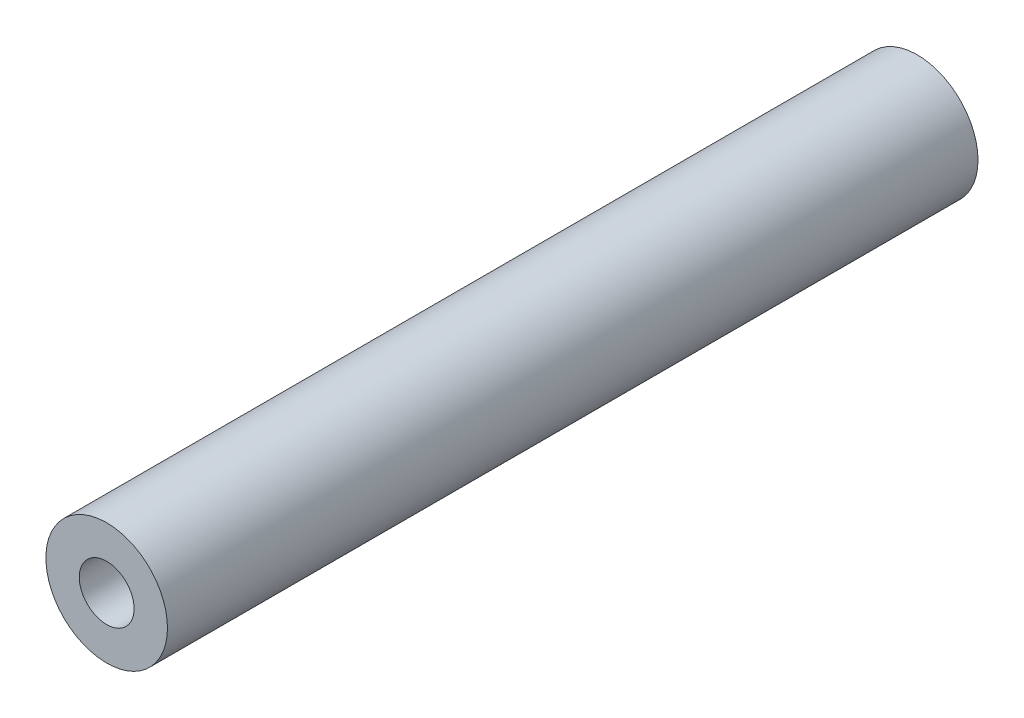
ISO-10303-21;
HEADER;
FILE_DESCRIPTION(('STEP AP214'),'2;1');
FILE_NAME('part.step','',(''),(''),'','','');
FILE_SCHEMA(('AUTOMOTIVE_DESIGN { 1 0 10303 214 1 1 1 1 }'));
ENDSEC;
DATA;
#1=APPLICATION_CONTEXT('core data for automotive mechanical design processes');
#2=APPLICATION_PROTOCOL_DEFINITION('international standard','automotive_design',2000,#1);
#3=PRODUCT_CONTEXT('',#1,'mechanical');
#4=PRODUCT('Part','Part','',(#3));
#5=PRODUCT_RELATED_PRODUCT_CATEGORY('part','',(#4));
#6=PRODUCT_DEFINITION_FORMATION('','',#4);
#7=PRODUCT_DEFINITION_CONTEXT('part definition',#1,'design');
#8=PRODUCT_DEFINITION('design','',#6,#7);
#9=PRODUCT_DEFINITION_SHAPE('','',#8);
#10=(LENGTH_UNIT() NAMED_UNIT(*) SI_UNIT(.MILLI.,.METRE.));
#11=(NAMED_UNIT(*) PLANE_ANGLE_UNIT() SI_UNIT($,.RADIAN.));
#12=(NAMED_UNIT(*) SI_UNIT($,.STERADIAN.) SOLID_ANGLE_UNIT());
#13=UNCERTAINTY_MEASURE_WITH_UNIT(LENGTH_MEASURE(1.E-05),#10,'distance_accuracy_value','');
#14=(GEOMETRIC_REPRESENTATION_CONTEXT(3) GLOBAL_UNCERTAINTY_ASSIGNED_CONTEXT((#13)) GLOBAL_UNIT_ASSIGNED_CONTEXT((#10,
#11,#12)) REPRESENTATION_CONTEXT('',''));
#15=CARTESIAN_POINT('',(0.,0.,0.));
#16=DIRECTION('',(0.,0.,1.));
#17=DIRECTION('',(1.,0.,0.));
#18=AXIS2_PLACEMENT_3D('',#15,#16,#17);
#19=CARTESIAN_POINT('',(0.,0.,40.));
#20=DIRECTION('',(0.,0.,-1.));
#21=DIRECTION('',(-1.,0.,0.));
#22=AXIS2_PLACEMENT_3D('',#19,#20,#21);
#23=CYLINDRICAL_SURFACE('',#22,3.);
#24=CARTESIAN_POINT('',(0.,0.,40.));
#25=DIRECTION('',(0.,0.,1.));
#26=DIRECTION('',(1.,0.,0.));
#27=AXIS2_PLACEMENT_3D('',#24,#25,#26);
#28=CIRCLE('',#27,3.);
#29=CARTESIAN_POINT('',(3.,0.,40.));
#30=VERTEX_POINT('',#29);
#31=EDGE_CURVE('E11',#30,#30,#28,.T.);
#32=ORIENTED_EDGE('',*,*,#31,.F.);
#33=EDGE_LOOP('',(#32));
#34=FACE_BOUND('',#33,.T.);
#35=CARTESIAN_POINT('',(0.,0.,0.));
#36=DIRECTION('',(0.,0.,1.));
#37=DIRECTION('',(1.,0.,0.));
#38=AXIS2_PLACEMENT_3D('',#35,#36,#37);
#39=CIRCLE('',#38,3.);
#40=CARTESIAN_POINT('',(3.,0.,0.));
#41=VERTEX_POINT('',#40);
#42=EDGE_CURVE('E38',#41,#41,#39,.T.);
#43=ORIENTED_EDGE('',*,*,#42,.T.);
#44=EDGE_LOOP('',(#43));
#45=FACE_BOUND('',#44,.T.);
#46=ADVANCED_FACE('F35',(#34,#45),#23,.T.);
#47=CARTESIAN_POINT('',(0.,0.,40.));
#48=DIRECTION('',(0.,0.,1.));
#49=DIRECTION('',(1.,0.,0.));
#50=AXIS2_PLACEMENT_3D('',#47,#48,#49);
#51=PLANE('',#50);
#52=CARTESIAN_POINT('',(0.,0.,40.));
#53=DIRECTION('',(0.,0.,1.));
#54=DIRECTION('',(1.,0.,0.));
#55=AXIS2_PLACEMENT_3D('',#52,#53,#54);
#56=CIRCLE('',#55,1.35254999999999);
#57=CARTESIAN_POINT('',(1.35254999999999,0.,40.));
#58=VERTEX_POINT('',#57);
#59=EDGE_CURVE('E59',#58,#58,#56,.T.);
#60=ORIENTED_EDGE('',*,*,#59,.F.);
#61=EDGE_LOOP('',(#60));
#62=FACE_BOUND('',#61,.T.);
#63=ORIENTED_EDGE('',*,*,#31,.T.);
#64=EDGE_LOOP('',(#63));
#65=FACE_BOUND('',#64,.T.);
#66=ADVANCED_FACE('F77',(#62,#65),#51,.T.);
#67=CARTESIAN_POINT('',(0.,0.,0.));
#68=DIRECTION('',(0.,0.,1.));
#69=DIRECTION('',(1.,0.,0.));
#70=AXIS2_PLACEMENT_3D('',#67,#68,#69);
#71=PLANE('',#70);
#72=CARTESIAN_POINT('',(0.,0.,0.));
#73=DIRECTION('',(0.,0.,-1.));
#74=DIRECTION('',(-1.,0.,0.));
#75=AXIS2_PLACEMENT_3D('',#72,#73,#74);
#76=CIRCLE('',#75,1.35254999999999);
#77=CARTESIAN_POINT('',(-1.35254999999999,0.,0.));
#78=VERTEX_POINT('',#77);
#79=EDGE_CURVE('E58',#78,#78,#76,.T.);
#80=ORIENTED_EDGE('',*,*,#79,.F.);
#81=EDGE_LOOP('',(#80));
#82=FACE_BOUND('',#81,.T.);
#83=ORIENTED_EDGE('',*,*,#42,.F.);
#84=EDGE_LOOP('',(#83));
#85=FACE_BOUND('',#84,.T.);
#86=ADVANCED_FACE('F74',(#82,#85),#71,.F.);
#87=CARTESIAN_POINT('',(0.,0.,12.));
#88=DIRECTION('',(0.,0.,-1.));
#89=DIRECTION('',(-1.,0.,0.));
#90=AXIS2_PLACEMENT_3D('',#87,#88,#89);
#91=CONICAL_SURFACE('',#90,1.35255,1.02974425867665);
#92=CARTESIAN_POINT('',(0.,0.,12.8126940302657));
#93=VERTEX_POINT('',#92);
#94=VERTEX_LOOP('',#93);
#95=FACE_BOUND('',#94,.T.);
#96=CARTESIAN_POINT('',(0.,0.,12.));
#97=DIRECTION('',(0.,0.,-1.));
#98=DIRECTION('',(-1.,0.,0.));
#99=AXIS2_PLACEMENT_3D('',#96,#97,#98);
#100=CIRCLE('',#99,1.35255);
#101=CARTESIAN_POINT('',(-1.35255,0.,12.));
#102=VERTEX_POINT('',#101);
#103=EDGE_CURVE('E62',#102,#102,#100,.T.);
#104=ORIENTED_EDGE('',*,*,#103,.T.);
#105=EDGE_LOOP('',(#104));
#106=FACE_BOUND('',#105,.T.);
#107=ADVANCED_FACE('F76',(#95,#106),#91,.F.);
#108=CARTESIAN_POINT('',(0.,0.,0.));
#109=DIRECTION('',(0.,0.,-1.));
#110=DIRECTION('',(-1.,0.,0.));
#111=AXIS2_PLACEMENT_3D('',#108,#109,#110);
#112=CYLINDRICAL_SURFACE('',#111,1.35254999999999);
#113=ORIENTED_EDGE('',*,*,#103,.F.);
#114=EDGE_LOOP('',(#113));
#115=FACE_BOUND('',#114,.T.);
#116=ORIENTED_EDGE('',*,*,#79,.T.);
#117=EDGE_LOOP('',(#116));
#118=FACE_BOUND('',#117,.T.);
#119=ADVANCED_FACE('F52',(#115,#118),#112,.F.);
#120=CARTESIAN_POINT('',(0.,0.,28.));
#121=DIRECTION('',(0.,0.,1.));
#122=DIRECTION('',(1.,0.,0.));
#123=AXIS2_PLACEMENT_3D('',#120,#121,#122);
#124=CONICAL_SURFACE('',#123,1.35255,1.02974425867665);
#125=CARTESIAN_POINT('',(0.,0.,27.1873059697343));
#126=VERTEX_POINT('',#125);
#127=VERTEX_LOOP('',#126);
#128=FACE_BOUND('',#127,.T.);
#129=CARTESIAN_POINT('',(0.,0.,28.));
#130=DIRECTION('',(0.,0.,1.));
#131=DIRECTION('',(1.,0.,0.));
#132=AXIS2_PLACEMENT_3D('',#129,#130,#131);
#133=CIRCLE('',#132,1.35255);
#134=CARTESIAN_POINT('',(1.35255,0.,28.));
#135=VERTEX_POINT('',#134);
#136=EDGE_CURVE('E56',#135,#135,#133,.T.);
#137=ORIENTED_EDGE('',*,*,#136,.T.);
#138=EDGE_LOOP('',(#137));
#139=FACE_BOUND('',#138,.T.);
#140=ADVANCED_FACE('F48',(#128,#139),#124,.F.);
#141=CARTESIAN_POINT('',(0.,0.,40.));
#142=DIRECTION('',(0.,0.,1.));
#143=DIRECTION('',(1.,0.,0.));
#144=AXIS2_PLACEMENT_3D('',#141,#142,#143);
#145=CYLINDRICAL_SURFACE('',#144,1.35254999999999);
#146=ORIENTED_EDGE('',*,*,#136,.F.);
#147=EDGE_LOOP('',(#146));
#148=FACE_BOUND('',#147,.T.);
#149=ORIENTED_EDGE('',*,*,#59,.T.);
#150=EDGE_LOOP('',(#149));
#151=FACE_BOUND('',#150,.T.);
#152=ADVANCED_FACE('F51',(#148,#151),#145,.F.);
#153=CLOSED_SHELL('',(#46,#66,#86,#107,#119,#140,#152));
#154=MANIFOLD_SOLID_BREP('B2',#153);
#155=ADVANCED_BREP_SHAPE_REPRESENTATION('',(#18,#154),#14);
#156=SHAPE_DEFINITION_REPRESENTATION(#9,#155);
ENDSEC;
END-ISO-10303-21;
